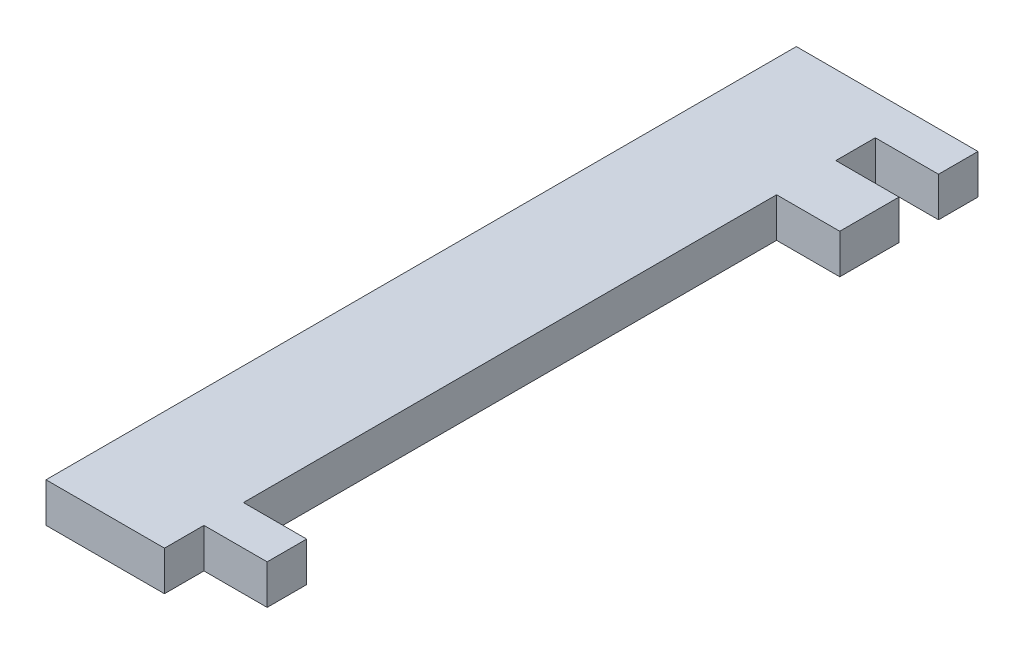
ISO-10303-21;
HEADER;
FILE_DESCRIPTION(('STEP AP214'),'2;1');
FILE_NAME('part.step','',(''),(''),'','','');
FILE_SCHEMA(('AUTOMOTIVE_DESIGN { 1 0 10303 214 1 1 1 1 }'));
ENDSEC;
DATA;
#1=APPLICATION_CONTEXT('core data for automotive mechanical design processes');
#2=APPLICATION_PROTOCOL_DEFINITION('international standard','automotive_design',2000,#1);
#3=PRODUCT_CONTEXT('',#1,'mechanical');
#4=PRODUCT('Part','Part','',(#3));
#5=PRODUCT_RELATED_PRODUCT_CATEGORY('part','',(#4));
#6=PRODUCT_DEFINITION_FORMATION('','',#4);
#7=PRODUCT_DEFINITION_CONTEXT('part definition',#1,'design');
#8=PRODUCT_DEFINITION('design','',#6,#7);
#9=PRODUCT_DEFINITION_SHAPE('','',#8);
#10=(LENGTH_UNIT() NAMED_UNIT(*) SI_UNIT(.MILLI.,.METRE.));
#11=(NAMED_UNIT(*) PLANE_ANGLE_UNIT() SI_UNIT($,.RADIAN.));
#12=(NAMED_UNIT(*) SI_UNIT($,.STERADIAN.) SOLID_ANGLE_UNIT());
#13=UNCERTAINTY_MEASURE_WITH_UNIT(LENGTH_MEASURE(1.E-05),#10,'distance_accuracy_value','');
#14=(GEOMETRIC_REPRESENTATION_CONTEXT(3) GLOBAL_UNCERTAINTY_ASSIGNED_CONTEXT((#13)) GLOBAL_UNIT_ASSIGNED_CONTEXT((#10,
#11,#12)) REPRESENTATION_CONTEXT('',''));
#15=CARTESIAN_POINT('',(0.,0.,0.));
#16=DIRECTION('',(0.,0.,1.));
#17=DIRECTION('',(1.,0.,0.));
#18=AXIS2_PLACEMENT_3D('',#15,#16,#17);
#19=CARTESIAN_POINT('',(7.5,-2.5,90.));
#20=DIRECTION('',(-1.,0.,0.));
#21=DIRECTION('',(0.,0.,1.));
#22=AXIS2_PLACEMENT_3D('',#19,#20,#21);
#23=PLANE('',#22);
#24=DIRECTION('',(0.,0.,-1.));
#25=VECTOR('',#24,1.);
#26=CARTESIAN_POINT('',(7.5,2.5,90.));
#27=LINE('',#26,#25);
#28=CARTESIAN_POINT('',(7.5,2.5,80.));
#29=VERTEX_POINT('',#28);
#30=CARTESIAN_POINT('',(7.5,2.5,12.5));
#31=VERTEX_POINT('',#30);
#32=EDGE_CURVE('E37',#29,#31,#27,.T.);
#33=ORIENTED_EDGE('',*,*,#32,.F.);
#34=DIRECTION('',(0.,-1.,0.));
#35=VECTOR('',#34,1.);
#36=CARTESIAN_POINT('',(7.5,-2.5,80.));
#37=LINE('',#36,#35);
#38=CARTESIAN_POINT('',(7.5,-2.5,80.));
#39=VERTEX_POINT('',#38);
#40=EDGE_CURVE('E169',#29,#39,#37,.T.);
#41=ORIENTED_EDGE('',*,*,#40,.T.);
#42=DIRECTION('',(0.,0.,-1.));
#43=VECTOR('',#42,1.);
#44=CARTESIAN_POINT('',(7.5,-2.5,90.));
#45=LINE('',#44,#43);
#46=CARTESIAN_POINT('',(7.5,-2.5,12.5));
#47=VERTEX_POINT('',#46);
#48=EDGE_CURVE('E261',#39,#47,#45,.T.);
#49=ORIENTED_EDGE('',*,*,#48,.T.);
#50=DIRECTION('',(0.,1.,0.));
#51=VECTOR('',#50,1.);
#52=CARTESIAN_POINT('',(7.5,-2.5,12.5));
#53=LINE('',#52,#51);
#54=EDGE_CURVE('E187',#47,#31,#53,.T.);
#55=ORIENTED_EDGE('',*,*,#54,.T.);
#56=EDGE_LOOP('',(#33,#41,#49,#55));
#57=FACE_BOUND('',#56,.T.);
#58=ADVANCED_FACE('F33',(#57),#23,.F.);
#59=CARTESIAN_POINT('',(7.5,2.5,5.00000000000001));
#60=VERTEX_POINT('',#59);
#61=CARTESIAN_POINT('',(7.5,2.5,0.));
#62=VERTEX_POINT('',#61);
#63=EDGE_CURVE('E252',#60,#62,#27,.T.);
#64=ORIENTED_EDGE('',*,*,#63,.F.);
#65=DIRECTION('',(0.,-1.,0.));
#66=VECTOR('',#65,1.);
#67=CARTESIAN_POINT('',(7.5,-2.5,5.));
#68=LINE('',#67,#66);
#69=CARTESIAN_POINT('',(7.5,-2.5,5.));
#70=VERTEX_POINT('',#69);
#71=EDGE_CURVE('E192',#60,#70,#68,.T.);
#72=ORIENTED_EDGE('',*,*,#71,.T.);
#73=CARTESIAN_POINT('',(7.5,-2.5,0.));
#74=VERTEX_POINT('',#73);
#75=EDGE_CURVE('E260',#70,#74,#45,.T.);
#76=ORIENTED_EDGE('',*,*,#75,.T.);
#77=DIRECTION('',(0.,1.,0.));
#78=VECTOR('',#77,1.);
#79=CARTESIAN_POINT('',(7.5,-2.5,0.));
#80=LINE('',#79,#78);
#81=EDGE_CURVE('E226',#74,#62,#80,.T.);
#82=ORIENTED_EDGE('',*,*,#81,.T.);
#83=EDGE_LOOP('',(#64,#72,#76,#82));
#84=FACE_BOUND('',#83,.T.);
#85=ADVANCED_FACE('F294',(#84),#23,.F.);
#86=CARTESIAN_POINT('',(7.5,-2.5,90.));
#87=VERTEX_POINT('',#86);
#88=CARTESIAN_POINT('',(7.5,-2.5,85.));
#89=VERTEX_POINT('',#88);
#90=EDGE_CURVE('E242',#87,#89,#45,.T.);
#91=ORIENTED_EDGE('',*,*,#90,.T.);
#92=DIRECTION('',(0.,1.,0.));
#93=VECTOR('',#92,1.);
#94=CARTESIAN_POINT('',(7.5,-2.5,85.));
#95=LINE('',#94,#93);
#96=CARTESIAN_POINT('',(7.5,2.5,85.));
#97=VERTEX_POINT('',#96);
#98=EDGE_CURVE('E143',#89,#97,#95,.T.);
#99=ORIENTED_EDGE('',*,*,#98,.T.);
#100=CARTESIAN_POINT('',(7.5,2.5,90.));
#101=VERTEX_POINT('',#100);
#102=EDGE_CURVE('E11',#101,#97,#27,.T.);
#103=ORIENTED_EDGE('',*,*,#102,.F.);
#104=DIRECTION('',(0.,1.,0.));
#105=VECTOR('',#104,1.);
#106=CARTESIAN_POINT('',(7.5,-2.5,90.));
#107=LINE('',#106,#105);
#108=EDGE_CURVE('E219',#87,#101,#107,.T.);
#109=ORIENTED_EDGE('',*,*,#108,.F.);
#110=EDGE_LOOP('',(#91,#99,#103,#109));
#111=FACE_BOUND('',#110,.T.);
#112=ADVANCED_FACE('F35',(#111),#23,.F.);
#113=CARTESIAN_POINT('',(-7.5,2.5,90.));
#114=DIRECTION('',(0.,-1.,0.));
#115=DIRECTION('',(0.,0.,-1.));
#116=AXIS2_PLACEMENT_3D('',#113,#114,#115);
#117=PLANE('',#116);
#118=ORIENTED_EDGE('',*,*,#102,.T.);
#119=DIRECTION('',(1.,0.,0.));
#120=VECTOR('',#119,1.);
#121=CARTESIAN_POINT('',(-7.5,2.5,85.));
#122=LINE('',#121,#120);
#123=CARTESIAN_POINT('',(15.5,2.5,85.));
#124=VERTEX_POINT('',#123);
#125=EDGE_CURVE('E163',#97,#124,#122,.T.);
#126=ORIENTED_EDGE('',*,*,#125,.T.);
#127=DIRECTION('',(0.,0.,-1.));
#128=VECTOR('',#127,1.);
#129=CARTESIAN_POINT('',(15.5,2.5,85.));
#130=LINE('',#129,#128);
#131=CARTESIAN_POINT('',(15.5,2.5,80.));
#132=VERTEX_POINT('',#131);
#133=EDGE_CURVE('E154',#124,#132,#130,.T.);
#134=ORIENTED_EDGE('',*,*,#133,.T.);
#135=DIRECTION('',(-1.,0.,0.));
#136=VECTOR('',#135,1.);
#137=CARTESIAN_POINT('',(-7.5,2.5,80.));
#138=LINE('',#137,#136);
#139=EDGE_CURVE('E50',#132,#29,#138,.T.);
#140=ORIENTED_EDGE('',*,*,#139,.T.);
#141=ORIENTED_EDGE('',*,*,#32,.T.);
#142=DIRECTION('',(1.,0.,0.));
#143=VECTOR('',#142,1.);
#144=CARTESIAN_POINT('',(-7.5,2.5,12.5));
#145=LINE('',#144,#143);
#146=CARTESIAN_POINT('',(15.5,2.5,12.5));
#147=VERTEX_POINT('',#146);
#148=EDGE_CURVE('E172',#31,#147,#145,.T.);
#149=ORIENTED_EDGE('',*,*,#148,.T.);
#150=DIRECTION('',(0.,0.,-1.));
#151=VECTOR('',#150,1.);
#152=CARTESIAN_POINT('',(15.5,2.5,5.));
#153=LINE('',#152,#151);
#154=CARTESIAN_POINT('',(15.5,2.5,5.));
#155=VERTEX_POINT('',#154);
#156=EDGE_CURVE('E182',#147,#155,#153,.T.);
#157=ORIENTED_EDGE('',*,*,#156,.T.);
#158=DIRECTION('',(-1.,0.,0.));
#159=VECTOR('',#158,1.);
#160=CARTESIAN_POINT('',(-7.5,2.5,5.));
#161=LINE('',#160,#159);
#162=EDGE_CURVE('E57',#155,#60,#161,.T.);
#163=ORIENTED_EDGE('',*,*,#162,.T.);
#164=ORIENTED_EDGE('',*,*,#63,.T.);
#165=DIRECTION('',(1.,0.,0.));
#166=VECTOR('',#165,1.);
#167=CARTESIAN_POINT('',(7.5,2.5,0.));
#168=LINE('',#167,#166);
#169=CARTESIAN_POINT('',(15.5,2.5,0.));
#170=VERTEX_POINT('',#169);
#171=EDGE_CURVE('E195',#62,#170,#168,.T.);
#172=ORIENTED_EDGE('',*,*,#171,.T.);
#173=DIRECTION('',(0.,0.,1.));
#174=VECTOR('',#173,1.);
#175=CARTESIAN_POINT('',(15.5,2.5,-5.));
#176=LINE('',#175,#174);
#177=CARTESIAN_POINT('',(15.5,2.5,-5.));
#178=VERTEX_POINT('',#177);
#179=EDGE_CURVE('E215',#178,#170,#176,.T.);
#180=ORIENTED_EDGE('',*,*,#179,.F.);
#181=DIRECTION('',(1.,0.,0.));
#182=VECTOR('',#181,1.);
#183=CARTESIAN_POINT('',(-7.5,2.5,-5.));
#184=LINE('',#183,#182);
#185=CARTESIAN_POINT('',(-7.5,2.5,-5.));
#186=VERTEX_POINT('',#185);
#187=EDGE_CURVE('E196',#186,#178,#184,.T.);
#188=ORIENTED_EDGE('',*,*,#187,.F.);
#189=DIRECTION('',(0.,0.,-1.));
#190=VECTOR('',#189,1.);
#191=CARTESIAN_POINT('',(-7.5,2.5,90.));
#192=LINE('',#191,#190);
#193=CARTESIAN_POINT('',(-7.5,2.5,90.));
#194=VERTEX_POINT('',#193);
#195=EDGE_CURVE('E251',#194,#186,#192,.T.);
#196=ORIENTED_EDGE('',*,*,#195,.F.);
#197=DIRECTION('',(-1.,0.,0.));
#198=VECTOR('',#197,1.);
#199=CARTESIAN_POINT('',(-7.5,2.5,90.));
#200=LINE('',#199,#198);
#201=EDGE_CURVE('E238',#101,#194,#200,.T.);
#202=ORIENTED_EDGE('',*,*,#201,.F.);
#203=EDGE_LOOP('',(#118,#126,#134,#140,#141,#149,#157,#163,#164,#172,#180,#188,#196,#202));
#204=FACE_BOUND('',#203,.T.);
#205=ADVANCED_FACE('F276',(#204),#117,.F.);
#206=CARTESIAN_POINT('',(-7.5,-2.5,90.));
#207=DIRECTION('',(1.,0.,0.));
#208=DIRECTION('',(0.,0.,-1.));
#209=AXIS2_PLACEMENT_3D('',#206,#207,#208);
#210=PLANE('',#209);
#211=ORIENTED_EDGE('',*,*,#195,.T.);
#212=DIRECTION('',(0.,1.,0.));
#213=VECTOR('',#212,1.);
#214=CARTESIAN_POINT('',(-7.5,-2.5,-5.));
#215=LINE('',#214,#213);
#216=CARTESIAN_POINT('',(-7.5,-2.5,-5.));
#217=VERTEX_POINT('',#216);
#218=EDGE_CURVE('E204',#217,#186,#215,.T.);
#219=ORIENTED_EDGE('',*,*,#218,.F.);
#220=DIRECTION('',(0.,0.,-1.));
#221=VECTOR('',#220,1.);
#222=CARTESIAN_POINT('',(-7.5,-2.5,90.));
#223=LINE('',#222,#221);
#224=CARTESIAN_POINT('',(-7.5,-2.5,90.));
#225=VERTEX_POINT('',#224);
#226=EDGE_CURVE('E249',#225,#217,#223,.T.);
#227=ORIENTED_EDGE('',*,*,#226,.F.);
#228=DIRECTION('',(0.,-1.,0.));
#229=VECTOR('',#228,1.);
#230=CARTESIAN_POINT('',(-7.5,-2.5,90.));
#231=LINE('',#230,#229);
#232=EDGE_CURVE('E268',#194,#225,#231,.T.);
#233=ORIENTED_EDGE('',*,*,#232,.F.);
#234=EDGE_LOOP('',(#211,#219,#227,#233));
#235=FACE_BOUND('',#234,.T.);
#236=ADVANCED_FACE('F277',(#235),#210,.F.);
#237=CARTESIAN_POINT('',(-7.5,-2.5,90.));
#238=DIRECTION('',(0.,1.,0.));
#239=DIRECTION('',(0.,0.,1.));
#240=AXIS2_PLACEMENT_3D('',#237,#238,#239);
#241=PLANE('',#240);
#242=ORIENTED_EDGE('',*,*,#226,.T.);
#243=DIRECTION('',(-1.,0.,0.));
#244=VECTOR('',#243,1.);
#245=CARTESIAN_POINT('',(7.5,-2.5,-5.));
#246=LINE('',#245,#244);
#247=CARTESIAN_POINT('',(15.5,-2.5,-5.));
#248=VERTEX_POINT('',#247);
#249=EDGE_CURVE('E201',#248,#217,#246,.T.);
#250=ORIENTED_EDGE('',*,*,#249,.F.);
#251=DIRECTION('',(0.,0.,1.));
#252=VECTOR('',#251,1.);
#253=CARTESIAN_POINT('',(15.5,-2.5,-5.));
#254=LINE('',#253,#252);
#255=CARTESIAN_POINT('',(15.5,-2.5,0.));
#256=VERTEX_POINT('',#255);
#257=EDGE_CURVE('E207',#248,#256,#254,.T.);
#258=ORIENTED_EDGE('',*,*,#257,.T.);
#259=DIRECTION('',(-1.,0.,0.));
#260=VECTOR('',#259,1.);
#261=CARTESIAN_POINT('',(7.5,-2.5,0.));
#262=LINE('',#261,#260);
#263=EDGE_CURVE('E199',#256,#74,#262,.T.);
#264=ORIENTED_EDGE('',*,*,#263,.T.);
#265=ORIENTED_EDGE('',*,*,#75,.F.);
#266=DIRECTION('',(-1.,0.,0.));
#267=VECTOR('',#266,1.);
#268=CARTESIAN_POINT('',(-7.5,-2.5,5.));
#269=LINE('',#268,#267);
#270=CARTESIAN_POINT('',(15.5,-2.5,5.));
#271=VERTEX_POINT('',#270);
#272=EDGE_CURVE('E178',#271,#70,#269,.T.);
#273=ORIENTED_EDGE('',*,*,#272,.F.);
#274=DIRECTION('',(0.,0.,-1.));
#275=VECTOR('',#274,1.);
#276=CARTESIAN_POINT('',(15.5,-2.5,5.));
#277=LINE('',#276,#275);
#278=CARTESIAN_POINT('',(15.5,-2.5,12.5));
#279=VERTEX_POINT('',#278);
#280=EDGE_CURVE('E175',#279,#271,#277,.T.);
#281=ORIENTED_EDGE('',*,*,#280,.F.);
#282=DIRECTION('',(1.,0.,0.));
#283=VECTOR('',#282,1.);
#284=CARTESIAN_POINT('',(-7.5,-2.5,12.5));
#285=LINE('',#284,#283);
#286=EDGE_CURVE('E173',#47,#279,#285,.T.);
#287=ORIENTED_EDGE('',*,*,#286,.F.);
#288=ORIENTED_EDGE('',*,*,#48,.F.);
#289=DIRECTION('',(-1.,0.,0.));
#290=VECTOR('',#289,1.);
#291=CARTESIAN_POINT('',(-7.5,-2.5,80.));
#292=LINE('',#291,#290);
#293=CARTESIAN_POINT('',(15.5,-2.5,80.));
#294=VERTEX_POINT('',#293);
#295=EDGE_CURVE('E156',#294,#39,#292,.T.);
#296=ORIENTED_EDGE('',*,*,#295,.F.);
#297=DIRECTION('',(0.,0.,-1.));
#298=VECTOR('',#297,1.);
#299=CARTESIAN_POINT('',(15.5,-2.5,85.));
#300=LINE('',#299,#298);
#301=CARTESIAN_POINT('',(15.5,-2.5,85.));
#302=VERTEX_POINT('',#301);
#303=EDGE_CURVE('E148',#302,#294,#300,.T.);
#304=ORIENTED_EDGE('',*,*,#303,.F.);
#305=DIRECTION('',(1.,0.,0.));
#306=VECTOR('',#305,1.);
#307=CARTESIAN_POINT('',(-7.5,-2.5,85.));
#308=LINE('',#307,#306);
#309=EDGE_CURVE('E137',#89,#302,#308,.T.);
#310=ORIENTED_EDGE('',*,*,#309,.F.);
#311=ORIENTED_EDGE('',*,*,#90,.F.);
#312=DIRECTION('',(1.,0.,0.));
#313=VECTOR('',#312,1.);
#314=CARTESIAN_POINT('',(-7.5,-2.5,90.));
#315=LINE('',#314,#313);
#316=EDGE_CURVE('E247',#225,#87,#315,.T.);
#317=ORIENTED_EDGE('',*,*,#316,.F.);
#318=EDGE_LOOP('',(#242,#250,#258,#264,#265,#273,#281,#287,#288,#296,#304,#310,#311,#317));
#319=FACE_BOUND('',#318,.T.);
#320=ADVANCED_FACE('F158',(#319),#241,.F.);
#321=CARTESIAN_POINT('',(0.,0.,90.));
#322=DIRECTION('',(0.,0.,-1.));
#323=DIRECTION('',(-1.,0.,0.));
#324=AXIS2_PLACEMENT_3D('',#321,#322,#323);
#325=PLANE('',#324);
#326=ORIENTED_EDGE('',*,*,#108,.T.);
#327=ORIENTED_EDGE('',*,*,#201,.T.);
#328=ORIENTED_EDGE('',*,*,#232,.T.);
#329=ORIENTED_EDGE('',*,*,#316,.T.);
#330=EDGE_LOOP('',(#326,#327,#328,#329));
#331=FACE_BOUND('',#330,.T.);
#332=ADVANCED_FACE('F272',(#331),#325,.F.);
#333=CARTESIAN_POINT('',(15.5,2.5,-5.));
#334=DIRECTION('',(-1.,0.,0.));
#335=DIRECTION('',(0.,0.,1.));
#336=AXIS2_PLACEMENT_3D('',#333,#334,#335);
#337=PLANE('',#336);
#338=DIRECTION('',(0.,-1.,0.));
#339=VECTOR('',#338,1.);
#340=CARTESIAN_POINT('',(15.5,2.5,0.));
#341=LINE('',#340,#339);
#342=EDGE_CURVE('E210',#170,#256,#341,.T.);
#343=ORIENTED_EDGE('',*,*,#342,.T.);
#344=ORIENTED_EDGE('',*,*,#257,.F.);
#345=DIRECTION('',(0.,-1.,0.));
#346=VECTOR('',#345,1.);
#347=CARTESIAN_POINT('',(15.5,2.5,-5.));
#348=LINE('',#347,#346);
#349=EDGE_CURVE('E198',#178,#248,#348,.T.);
#350=ORIENTED_EDGE('',*,*,#349,.F.);
#351=ORIENTED_EDGE('',*,*,#179,.T.);
#352=EDGE_LOOP('',(#343,#344,#350,#351));
#353=FACE_BOUND('',#352,.T.);
#354=ADVANCED_FACE('F323',(#353),#337,.F.);
#355=CARTESIAN_POINT('',(0.,0.,-5.));
#356=DIRECTION('',(0.,0.,-1.));
#357=DIRECTION('',(-1.,0.,0.));
#358=AXIS2_PLACEMENT_3D('',#355,#356,#357);
#359=PLANE('',#358);
#360=ORIENTED_EDGE('',*,*,#187,.T.);
#361=ORIENTED_EDGE('',*,*,#349,.T.);
#362=ORIENTED_EDGE('',*,*,#249,.T.);
#363=ORIENTED_EDGE('',*,*,#218,.T.);
#364=EDGE_LOOP('',(#360,#361,#362,#363));
#365=FACE_BOUND('',#364,.T.);
#366=ADVANCED_FACE('F312',(#365),#359,.T.);
#367=CARTESIAN_POINT('',(0.,0.,0.));
#368=DIRECTION('',(0.,0.,-1.));
#369=DIRECTION('',(-1.,0.,0.));
#370=AXIS2_PLACEMENT_3D('',#367,#368,#369);
#371=PLANE('',#370);
#372=ORIENTED_EDGE('',*,*,#81,.F.);
#373=ORIENTED_EDGE('',*,*,#263,.F.);
#374=ORIENTED_EDGE('',*,*,#342,.F.);
#375=ORIENTED_EDGE('',*,*,#171,.F.);
#376=EDGE_LOOP('',(#372,#373,#374,#375));
#377=FACE_BOUND('',#376,.T.);
#378=ADVANCED_FACE('F307',(#377),#371,.F.);
#379=CARTESIAN_POINT('',(-7.5,-2.5,5.));
#380=DIRECTION('',(0.,0.,-1.));
#381=DIRECTION('',(-1.,0.,0.));
#382=AXIS2_PLACEMENT_3D('',#379,#380,#381);
#383=PLANE('',#382);
#384=ORIENTED_EDGE('',*,*,#71,.F.);
#385=ORIENTED_EDGE('',*,*,#162,.F.);
#386=DIRECTION('',(0.,1.,0.));
#387=VECTOR('',#386,1.);
#388=CARTESIAN_POINT('',(15.5,-2.5,5.));
#389=LINE('',#388,#387);
#390=EDGE_CURVE('E185',#271,#155,#389,.T.);
#391=ORIENTED_EDGE('',*,*,#390,.F.);
#392=ORIENTED_EDGE('',*,*,#272,.T.);
#393=EDGE_LOOP('',(#384,#385,#391,#392));
#394=FACE_BOUND('',#393,.T.);
#395=ADVANCED_FACE('F292',(#394),#383,.T.);
#396=CARTESIAN_POINT('',(-7.5,-2.5,12.5));
#397=DIRECTION('',(0.,0.,1.));
#398=DIRECTION('',(1.,0.,0.));
#399=AXIS2_PLACEMENT_3D('',#396,#397,#398);
#400=PLANE('',#399);
#401=ORIENTED_EDGE('',*,*,#54,.F.);
#402=ORIENTED_EDGE('',*,*,#286,.T.);
#403=DIRECTION('',(0.,1.,0.));
#404=VECTOR('',#403,1.);
#405=CARTESIAN_POINT('',(15.5,-2.5,12.5));
#406=LINE('',#405,#404);
#407=EDGE_CURVE('E180',#279,#147,#406,.T.);
#408=ORIENTED_EDGE('',*,*,#407,.T.);
#409=ORIENTED_EDGE('',*,*,#148,.F.);
#410=EDGE_LOOP('',(#401,#402,#408,#409));
#411=FACE_BOUND('',#410,.T.);
#412=ADVANCED_FACE('F284',(#411),#400,.T.);
#413=CARTESIAN_POINT('',(15.5,-2.5,5.));
#414=DIRECTION('',(1.,0.,0.));
#415=DIRECTION('',(0.,0.,-1.));
#416=AXIS2_PLACEMENT_3D('',#413,#414,#415);
#417=PLANE('',#416);
#418=ORIENTED_EDGE('',*,*,#156,.F.);
#419=ORIENTED_EDGE('',*,*,#407,.F.);
#420=ORIENTED_EDGE('',*,*,#280,.T.);
#421=ORIENTED_EDGE('',*,*,#390,.T.);
#422=EDGE_LOOP('',(#418,#419,#420,#421));
#423=FACE_BOUND('',#422,.T.);
#424=ADVANCED_FACE('F290',(#423),#417,.T.);
#425=CARTESIAN_POINT('',(-7.5,-2.5,80.));
#426=DIRECTION('',(0.,0.,-1.));
#427=DIRECTION('',(-1.,0.,0.));
#428=AXIS2_PLACEMENT_3D('',#425,#426,#427);
#429=PLANE('',#428);
#430=ORIENTED_EDGE('',*,*,#40,.F.);
#431=ORIENTED_EDGE('',*,*,#139,.F.);
#432=DIRECTION('',(0.,1.,0.));
#433=VECTOR('',#432,1.);
#434=CARTESIAN_POINT('',(15.5,-2.5,80.));
#435=LINE('',#434,#433);
#436=EDGE_CURVE('E155',#294,#132,#435,.T.);
#437=ORIENTED_EDGE('',*,*,#436,.F.);
#438=ORIENTED_EDGE('',*,*,#295,.T.);
#439=EDGE_LOOP('',(#430,#431,#437,#438));
#440=FACE_BOUND('',#439,.T.);
#441=ADVANCED_FACE('F280',(#440),#429,.T.);
#442=CARTESIAN_POINT('',(-7.5,-2.5,85.));
#443=DIRECTION('',(0.,0.,1.));
#444=DIRECTION('',(1.,0.,0.));
#445=AXIS2_PLACEMENT_3D('',#442,#443,#444);
#446=PLANE('',#445);
#447=ORIENTED_EDGE('',*,*,#98,.F.);
#448=ORIENTED_EDGE('',*,*,#309,.T.);
#449=DIRECTION('',(0.,1.,0.));
#450=VECTOR('',#449,1.);
#451=CARTESIAN_POINT('',(15.5,-2.5,85.));
#452=LINE('',#451,#450);
#453=EDGE_CURVE('E140',#302,#124,#452,.T.);
#454=ORIENTED_EDGE('',*,*,#453,.T.);
#455=ORIENTED_EDGE('',*,*,#125,.F.);
#456=EDGE_LOOP('',(#447,#448,#454,#455));
#457=FACE_BOUND('',#456,.T.);
#458=ADVANCED_FACE('F139',(#457),#446,.T.);
#459=CARTESIAN_POINT('',(15.5,-2.5,85.));
#460=DIRECTION('',(1.,0.,0.));
#461=DIRECTION('',(0.,0.,-1.));
#462=AXIS2_PLACEMENT_3D('',#459,#460,#461);
#463=PLANE('',#462);
#464=ORIENTED_EDGE('',*,*,#133,.F.);
#465=ORIENTED_EDGE('',*,*,#453,.F.);
#466=ORIENTED_EDGE('',*,*,#303,.T.);
#467=ORIENTED_EDGE('',*,*,#436,.T.);
#468=EDGE_LOOP('',(#464,#465,#466,#467));
#469=FACE_BOUND('',#468,.T.);
#470=ADVANCED_FACE('F152',(#469),#463,.T.);
#471=CLOSED_SHELL('',(#58,#85,#112,#205,#236,#320,#332,#354,#366,#378,#395,#412,#424,#441,#458,#470));
#472=MANIFOLD_SOLID_BREP('B2',#471);
#473=ADVANCED_BREP_SHAPE_REPRESENTATION('',(#18,#472),#14);
#474=SHAPE_DEFINITION_REPRESENTATION(#9,#473);
ENDSEC;
END-ISO-10303-21;
